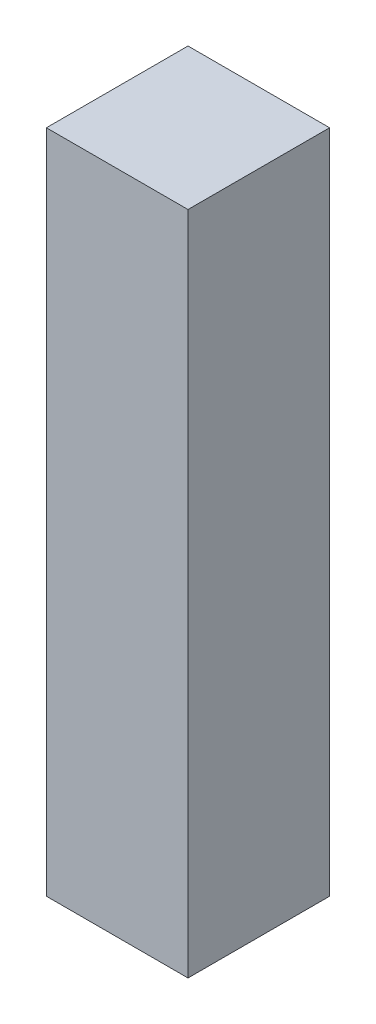
ISO-10303-21;
HEADER;
FILE_DESCRIPTION(('STEP AP214'),'2;1');
FILE_NAME('part.step','',(''),(''),'','','');
FILE_SCHEMA(('AUTOMOTIVE_DESIGN { 1 0 10303 214 1 1 1 1 }'));
ENDSEC;
DATA;
#1=APPLICATION_CONTEXT('core data for automotive mechanical design processes');
#2=APPLICATION_PROTOCOL_DEFINITION('international standard','automotive_design',2000,#1);
#3=PRODUCT_CONTEXT('',#1,'mechanical');
#4=PRODUCT('Part','Part','',(#3));
#5=PRODUCT_RELATED_PRODUCT_CATEGORY('part','',(#4));
#6=PRODUCT_DEFINITION_FORMATION('','',#4);
#7=PRODUCT_DEFINITION_CONTEXT('part definition',#1,'design');
#8=PRODUCT_DEFINITION('design','',#6,#7);
#9=PRODUCT_DEFINITION_SHAPE('','',#8);
#10=(LENGTH_UNIT() NAMED_UNIT(*) SI_UNIT(.MILLI.,.METRE.));
#11=(NAMED_UNIT(*) PLANE_ANGLE_UNIT() SI_UNIT($,.RADIAN.));
#12=(NAMED_UNIT(*) SI_UNIT($,.STERADIAN.) SOLID_ANGLE_UNIT());
#13=UNCERTAINTY_MEASURE_WITH_UNIT(LENGTH_MEASURE(1.E-05),#10,'distance_accuracy_value','');
#14=(GEOMETRIC_REPRESENTATION_CONTEXT(3) GLOBAL_UNCERTAINTY_ASSIGNED_CONTEXT((#13)) GLOBAL_UNIT_ASSIGNED_CONTEXT((#10,
#11,#12)) REPRESENTATION_CONTEXT('',''));
#15=CARTESIAN_POINT('',(0.,0.,0.));
#16=DIRECTION('',(0.,0.,1.));
#17=DIRECTION('',(1.,0.,0.));
#18=AXIS2_PLACEMENT_3D('',#15,#16,#17);
#19=CARTESIAN_POINT('',(-100.,-940.,100.));
#20=DIRECTION('',(-1.,0.,0.));
#21=DIRECTION('',(0.,0.,1.));
#22=AXIS2_PLACEMENT_3D('',#19,#20,#21);
#23=PLANE('',#22);
#24=DIRECTION('',(0.,0.,1.));
#25=VECTOR('',#24,1.);
#26=CARTESIAN_POINT('',(-100.,0.,100.));
#27=LINE('',#26,#25);
#28=CARTESIAN_POINT('',(-100.,0.,-100.));
#29=VERTEX_POINT('',#28);
#30=CARTESIAN_POINT('',(-100.,0.,100.));
#31=VERTEX_POINT('',#30);
#32=EDGE_CURVE('E113',#29,#31,#27,.T.);
#33=ORIENTED_EDGE('',*,*,#32,.F.);
#34=DIRECTION('',(0.,1.,0.));
#35=VECTOR('',#34,1.);
#36=CARTESIAN_POINT('',(-100.,-940.,-100.));
#37=LINE('',#36,#35);
#38=CARTESIAN_POINT('',(-100.,-940.,-100.));
#39=VERTEX_POINT('',#38);
#40=EDGE_CURVE('E11',#39,#29,#37,.T.);
#41=ORIENTED_EDGE('',*,*,#40,.F.);
#42=DIRECTION('',(0.,0.,1.));
#43=VECTOR('',#42,1.);
#44=CARTESIAN_POINT('',(-100.,-940.,100.));
#45=LINE('',#44,#43);
#46=CARTESIAN_POINT('',(-100.,-940.,100.));
#47=VERTEX_POINT('',#46);
#48=EDGE_CURVE('E105',#39,#47,#45,.T.);
#49=ORIENTED_EDGE('',*,*,#48,.T.);
#50=DIRECTION('',(0.,1.,0.));
#51=VECTOR('',#50,1.);
#52=CARTESIAN_POINT('',(-100.,-940.,100.));
#53=LINE('',#52,#51);
#54=EDGE_CURVE('E46',#47,#31,#53,.T.);
#55=ORIENTED_EDGE('',*,*,#54,.T.);
#56=EDGE_LOOP('',(#33,#41,#49,#55));
#57=FACE_BOUND('',#56,.T.);
#58=ADVANCED_FACE('F43',(#57),#23,.T.);
#59=CARTESIAN_POINT('',(100.,-940.,-100.));
#60=DIRECTION('',(0.,0.,-1.));
#61=DIRECTION('',(-1.,0.,0.));
#62=AXIS2_PLACEMENT_3D('',#59,#60,#61);
#63=PLANE('',#62);
#64=DIRECTION('',(-1.,0.,0.));
#65=VECTOR('',#64,1.);
#66=CARTESIAN_POINT('',(100.,0.,-100.));
#67=LINE('',#66,#65);
#68=CARTESIAN_POINT('',(100.,0.,-100.));
#69=VERTEX_POINT('',#68);
#70=EDGE_CURVE('E108',#69,#29,#67,.T.);
#71=ORIENTED_EDGE('',*,*,#70,.F.);
#72=DIRECTION('',(0.,1.,0.));
#73=VECTOR('',#72,1.);
#74=CARTESIAN_POINT('',(100.,-940.,-100.));
#75=LINE('',#74,#73);
#76=CARTESIAN_POINT('',(100.,-940.,-100.));
#77=VERTEX_POINT('',#76);
#78=EDGE_CURVE('E53',#77,#69,#75,.T.);
#79=ORIENTED_EDGE('',*,*,#78,.F.);
#80=DIRECTION('',(-1.,0.,0.));
#81=VECTOR('',#80,1.);
#82=CARTESIAN_POINT('',(100.,-940.,-100.));
#83=LINE('',#82,#81);
#84=EDGE_CURVE('E100',#77,#39,#83,.T.);
#85=ORIENTED_EDGE('',*,*,#84,.T.);
#86=ORIENTED_EDGE('',*,*,#40,.T.);
#87=EDGE_LOOP('',(#71,#79,#85,#86));
#88=FACE_BOUND('',#87,.T.);
#89=ADVANCED_FACE('F129',(#88),#63,.T.);
#90=CARTESIAN_POINT('',(100.,-940.,100.));
#91=DIRECTION('',(1.,0.,0.));
#92=DIRECTION('',(0.,0.,-1.));
#93=AXIS2_PLACEMENT_3D('',#90,#91,#92);
#94=PLANE('',#93);
#95=DIRECTION('',(0.,0.,-1.));
#96=VECTOR('',#95,1.);
#97=CARTESIAN_POINT('',(100.,0.,100.));
#98=LINE('',#97,#96);
#99=CARTESIAN_POINT('',(100.,0.,100.));
#100=VERTEX_POINT('',#99);
#101=EDGE_CURVE('E94',#100,#69,#98,.T.);
#102=ORIENTED_EDGE('',*,*,#101,.F.);
#103=DIRECTION('',(0.,1.,0.));
#104=VECTOR('',#103,1.);
#105=CARTESIAN_POINT('',(100.,-940.,100.));
#106=LINE('',#105,#104);
#107=CARTESIAN_POINT('',(100.,-940.,100.));
#108=VERTEX_POINT('',#107);
#109=EDGE_CURVE('E89',#108,#100,#106,.T.);
#110=ORIENTED_EDGE('',*,*,#109,.F.);
#111=DIRECTION('',(0.,0.,-1.));
#112=VECTOR('',#111,1.);
#113=CARTESIAN_POINT('',(100.,-940.,100.));
#114=LINE('',#113,#112);
#115=EDGE_CURVE('E92',#108,#77,#114,.T.);
#116=ORIENTED_EDGE('',*,*,#115,.T.);
#117=ORIENTED_EDGE('',*,*,#78,.T.);
#118=EDGE_LOOP('',(#102,#110,#116,#117));
#119=FACE_BOUND('',#118,.T.);
#120=ADVANCED_FACE('F91',(#119),#94,.T.);
#121=CARTESIAN_POINT('',(100.,-940.,100.));
#122=DIRECTION('',(0.,0.,1.));
#123=DIRECTION('',(1.,0.,0.));
#124=AXIS2_PLACEMENT_3D('',#121,#122,#123);
#125=PLANE('',#124);
#126=DIRECTION('',(1.,0.,0.));
#127=VECTOR('',#126,1.);
#128=CARTESIAN_POINT('',(100.,0.,100.));
#129=LINE('',#128,#127);
#130=EDGE_CURVE('E117',#31,#100,#129,.T.);
#131=ORIENTED_EDGE('',*,*,#130,.F.);
#132=ORIENTED_EDGE('',*,*,#54,.F.);
#133=DIRECTION('',(1.,0.,0.));
#134=VECTOR('',#133,1.);
#135=CARTESIAN_POINT('',(100.,-940.,100.));
#136=LINE('',#135,#134);
#137=EDGE_CURVE('E99',#47,#108,#136,.T.);
#138=ORIENTED_EDGE('',*,*,#137,.T.);
#139=ORIENTED_EDGE('',*,*,#109,.T.);
#140=EDGE_LOOP('',(#131,#132,#138,#139));
#141=FACE_BOUND('',#140,.T.);
#142=ADVANCED_FACE('F103',(#141),#125,.T.);
#143=CARTESIAN_POINT('',(0.,-940.,0.));
#144=DIRECTION('',(0.,1.,0.));
#145=DIRECTION('',(0.,0.,1.));
#146=AXIS2_PLACEMENT_3D('',#143,#144,#145);
#147=PLANE('',#146);
#148=ORIENTED_EDGE('',*,*,#48,.F.);
#149=ORIENTED_EDGE('',*,*,#84,.F.);
#150=ORIENTED_EDGE('',*,*,#115,.F.);
#151=ORIENTED_EDGE('',*,*,#137,.F.);
#152=EDGE_LOOP('',(#148,#149,#150,#151));
#153=FACE_BOUND('',#152,.T.);
#154=ADVANCED_FACE('F98',(#153),#147,.F.);
#155=CARTESIAN_POINT('',(0.,0.,0.));
#156=DIRECTION('',(0.,1.,0.));
#157=DIRECTION('',(0.,0.,1.));
#158=AXIS2_PLACEMENT_3D('',#155,#156,#157);
#159=PLANE('',#158);
#160=ORIENTED_EDGE('',*,*,#32,.T.);
#161=ORIENTED_EDGE('',*,*,#130,.T.);
#162=ORIENTED_EDGE('',*,*,#101,.T.);
#163=ORIENTED_EDGE('',*,*,#70,.T.);
#164=EDGE_LOOP('',(#160,#161,#162,#163));
#165=FACE_BOUND('',#164,.T.);
#166=ADVANCED_FACE('F128',(#165),#159,.T.);
#167=CLOSED_SHELL('',(#58,#89,#120,#142,#154,#166));
#168=MANIFOLD_SOLID_BREP('B2',#167);
#169=ADVANCED_BREP_SHAPE_REPRESENTATION('',(#18,#168),#14);
#170=SHAPE_DEFINITION_REPRESENTATION(#9,#169);
ENDSEC;
END-ISO-10303-21;
